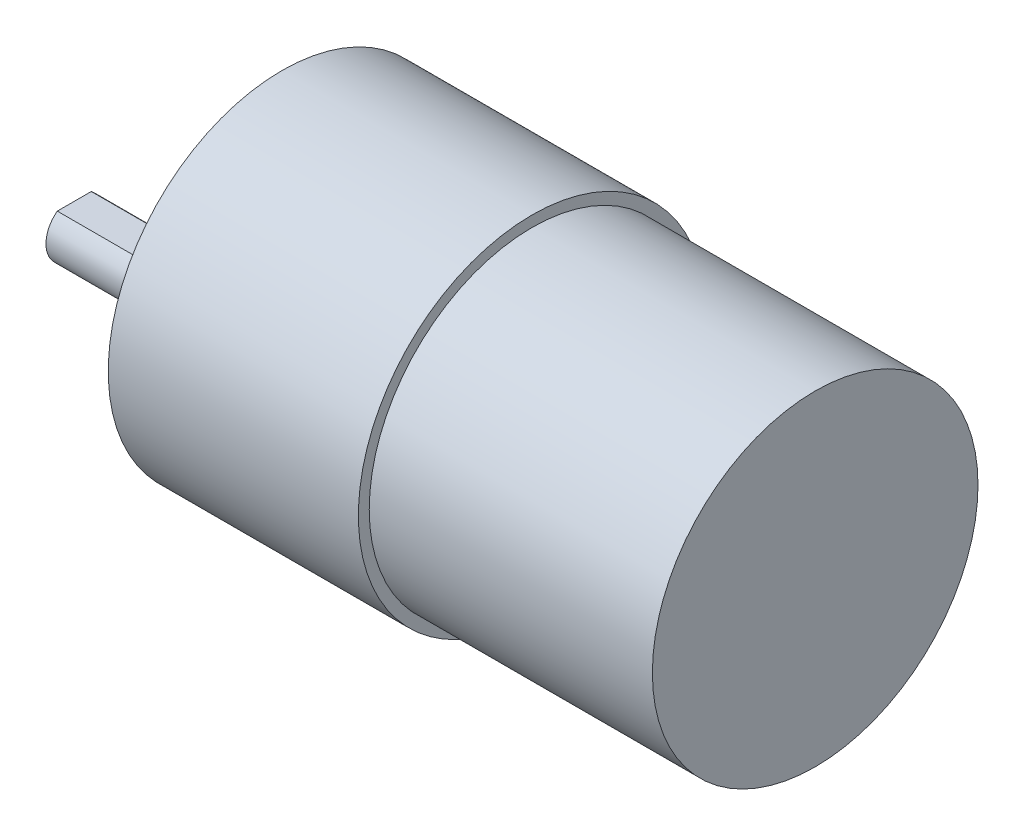
ISO-10303-21;
HEADER;
FILE_DESCRIPTION(('STEP AP214'),'2;1');
FILE_NAME('part.step','',(''),(''),'','','');
FILE_SCHEMA(('AUTOMOTIVE_DESIGN { 1 0 10303 214 1 1 1 1 }'));
ENDSEC;
DATA;
#1=APPLICATION_CONTEXT('core data for automotive mechanical design processes');
#2=APPLICATION_PROTOCOL_DEFINITION('international standard','automotive_design',2000,#1);
#3=PRODUCT_CONTEXT('',#1,'mechanical');
#4=PRODUCT('Part','Part','',(#3));
#5=PRODUCT_RELATED_PRODUCT_CATEGORY('part','',(#4));
#6=PRODUCT_DEFINITION_FORMATION('','',#4);
#7=PRODUCT_DEFINITION_CONTEXT('part definition',#1,'design');
#8=PRODUCT_DEFINITION('design','',#6,#7);
#9=PRODUCT_DEFINITION_SHAPE('','',#8);
#10=(LENGTH_UNIT() NAMED_UNIT(*) SI_UNIT(.MILLI.,.METRE.));
#11=(NAMED_UNIT(*) PLANE_ANGLE_UNIT() SI_UNIT($,.RADIAN.));
#12=(NAMED_UNIT(*) SI_UNIT($,.STERADIAN.) SOLID_ANGLE_UNIT());
#13=UNCERTAINTY_MEASURE_WITH_UNIT(LENGTH_MEASURE(1.E-05),#10,'distance_accuracy_value','');
#14=(GEOMETRIC_REPRESENTATION_CONTEXT(3) GLOBAL_UNCERTAINTY_ASSIGNED_CONTEXT((#13)) GLOBAL_UNIT_ASSIGNED_CONTEXT((#10,
#11,#12)) REPRESENTATION_CONTEXT('',''));
#15=CARTESIAN_POINT('',(0.,0.,0.));
#16=DIRECTION('',(0.,0.,1.));
#17=DIRECTION('',(1.,0.,0.));
#18=AXIS2_PLACEMENT_3D('',#15,#16,#17);
#19=CARTESIAN_POINT('',(-27.2521551588064,0.,0.));
#20=DIRECTION('',(-1.,0.,0.));
#21=DIRECTION('',(0.,-1.,0.));
#22=AXIS2_PLACEMENT_3D('',#19,#20,#21);
#23=PLANE('',#22);
#24=CARTESIAN_POINT('',(-27.2521551588064,-9.62592072726697,0.));
#25=DIRECTION('',(1.,0.,0.));
#26=DIRECTION('',(0.,1.,0.));
#27=AXIS2_PLACEMENT_3D('',#24,#25,#26);
#28=CIRCLE('',#27,17.25);
#29=CARTESIAN_POINT('',(-27.2521551588064,7.62407927273303,0.));
#30=VERTEX_POINT('',#29);
#31=EDGE_CURVE('E111',#30,#30,#28,.T.);
#32=ORIENTED_EDGE('',*,*,#31,.F.);
#33=EDGE_LOOP('',(#32));
#34=FACE_BOUND('',#33,.T.);
#35=CARTESIAN_POINT('',(-27.2521551588064,-9.62592072726697,0.));
#36=DIRECTION('',(1.,0.,0.));
#37=DIRECTION('',(0.,1.,0.));
#38=AXIS2_PLACEMENT_3D('',#35,#36,#37);
#39=CIRCLE('',#38,18.4);
#40=CARTESIAN_POINT('',(-27.2521551588064,8.77407927273302,0.));
#41=VERTEX_POINT('',#40);
#42=EDGE_CURVE('E102',#41,#41,#39,.T.);
#43=ORIENTED_EDGE('',*,*,#42,.T.);
#44=EDGE_LOOP('',(#43));
#45=FACE_BOUND('',#44,.T.);
#46=ADVANCED_FACE('F35',(#34,#45),#23,.F.);
#47=CARTESIAN_POINT('',(2.74784484119356,-9.62592072726697,0.));
#48=DIRECTION('',(1.,0.,0.));
#49=DIRECTION('',(0.,1.,0.));
#50=AXIS2_PLACEMENT_3D('',#47,#48,#49);
#51=CYLINDRICAL_SURFACE('',#50,17.25);
#52=ORIENTED_EDGE('',*,*,#31,.T.);
#53=EDGE_LOOP('',(#52));
#54=FACE_BOUND('',#53,.T.);
#55=CARTESIAN_POINT('',(2.74784484119356,-9.62592072726697,0.));
#56=DIRECTION('',(1.,0.,0.));
#57=DIRECTION('',(0.,1.,0.));
#58=AXIS2_PLACEMENT_3D('',#55,#56,#57);
#59=CIRCLE('',#58,17.25);
#60=CARTESIAN_POINT('',(2.74784484119356,7.62407927273303,0.));
#61=VERTEX_POINT('',#60);
#62=EDGE_CURVE('E108',#61,#61,#59,.T.);
#63=ORIENTED_EDGE('',*,*,#62,.F.);
#64=EDGE_LOOP('',(#63));
#65=FACE_BOUND('',#64,.T.);
#66=ADVANCED_FACE('F115',(#54,#65),#51,.T.);
#67=CARTESIAN_POINT('',(2.74784484119356,0.,0.));
#68=DIRECTION('',(-1.,0.,0.));
#69=DIRECTION('',(0.,-1.,0.));
#70=AXIS2_PLACEMENT_3D('',#67,#68,#69);
#71=PLANE('',#70);
#72=ORIENTED_EDGE('',*,*,#62,.T.);
#73=EDGE_LOOP('',(#72));
#74=FACE_BOUND('',#73,.T.);
#75=ADVANCED_FACE('F133',(#74),#71,.F.);
#76=CARTESIAN_POINT('',(-53.7521551588064,0.,0.));
#77=DIRECTION('',(1.,0.,0.));
#78=DIRECTION('',(0.,1.,0.));
#79=AXIS2_PLACEMENT_3D('',#76,#77,#78);
#80=PLANE('',#79);
#81=CARTESIAN_POINT('',(-53.7521551588064,-16.625920727267,0.));
#82=DIRECTION('',(1.,0.,0.));
#83=DIRECTION('',(0.,1.,0.));
#84=AXIS2_PLACEMENT_3D('',#81,#82,#83);
#85=CIRCLE('',#84,6.);
#86=CARTESIAN_POINT('',(-53.7521551588064,-10.625920727267,0.));
#87=VERTEX_POINT('',#86);
#88=EDGE_CURVE('E80',#87,#87,#85,.T.);
#89=ORIENTED_EDGE('',*,*,#88,.T.);
#90=EDGE_LOOP('',(#89));
#91=FACE_BOUND('',#90,.T.);
#92=CARTESIAN_POINT('',(-53.7521551588064,-9.62592072726698,0.));
#93=DIRECTION('',(1.,0.,0.));
#94=DIRECTION('',(0.,1.,0.));
#95=AXIS2_PLACEMENT_3D('',#92,#93,#94);
#96=CIRCLE('',#95,18.4);
#97=CARTESIAN_POINT('',(-53.7521551588064,8.77407927273302,0.));
#98=VERTEX_POINT('',#97);
#99=EDGE_CURVE('E105',#98,#98,#96,.T.);
#100=ORIENTED_EDGE('',*,*,#99,.F.);
#101=EDGE_LOOP('',(#100));
#102=FACE_BOUND('',#101,.T.);
#103=ADVANCED_FACE('F124',(#91,#102),#80,.F.);
#104=CARTESIAN_POINT('',(2.74784484119356,-9.62592072726697,0.));
#105=DIRECTION('',(1.,0.,0.));
#106=DIRECTION('',(0.,1.,0.));
#107=AXIS2_PLACEMENT_3D('',#104,#105,#106);
#108=CYLINDRICAL_SURFACE('',#107,18.4);
#109=ORIENTED_EDGE('',*,*,#99,.T.);
#110=EDGE_LOOP('',(#109));
#111=FACE_BOUND('',#110,.T.);
#112=ORIENTED_EDGE('',*,*,#42,.F.);
#113=EDGE_LOOP('',(#112));
#114=FACE_BOUND('',#113,.T.);
#115=ADVANCED_FACE('F122',(#111,#114),#108,.T.);
#116=CARTESIAN_POINT('',(2.74784484119356,-16.625920727267,0.));
#117=DIRECTION('',(1.,0.,0.));
#118=DIRECTION('',(0.,1.,0.));
#119=AXIS2_PLACEMENT_3D('',#116,#117,#118);
#120=CYLINDRICAL_SURFACE('',#119,3.);
#121=CARTESIAN_POINT('',(-63.7521551588064,-16.625920727267,0.));
#122=DIRECTION('',(1.,0.,0.));
#123=DIRECTION('',(0.,0.,-1.));
#124=AXIS2_PLACEMENT_3D('',#121,#122,#123);
#125=CIRCLE('',#124,3.);
#126=CARTESIAN_POINT('',(-63.7521551588064,-14.225920727267,1.8));
#127=VERTEX_POINT('',#126);
#128=CARTESIAN_POINT('',(-63.7521551588064,-14.225920727267,-1.8));
#129=VERTEX_POINT('',#128);
#130=EDGE_CURVE('E11',#127,#129,#125,.F.);
#131=ORIENTED_EDGE('',*,*,#130,.F.);
#132=DIRECTION('',(1.,0.,0.));
#133=VECTOR('',#132,1.);
#134=CARTESIAN_POINT('',(2.74784484119356,-14.225920727267,1.8));
#135=LINE('',#134,#133);
#136=CARTESIAN_POINT('',(-75.7521551588064,-14.225920727267,1.8));
#137=VERTEX_POINT('',#136);
#138=EDGE_CURVE('E64',#137,#127,#135,.T.);
#139=ORIENTED_EDGE('',*,*,#138,.F.);
#140=CARTESIAN_POINT('',(-75.7521551588064,-16.625920727267,0.));
#141=DIRECTION('',(1.,0.,0.));
#142=DIRECTION('',(0.,1.,0.));
#143=AXIS2_PLACEMENT_3D('',#140,#141,#142);
#144=CIRCLE('',#143,3.);
#145=CARTESIAN_POINT('',(-75.7521551588064,-14.225920727267,-1.8));
#146=VERTEX_POINT('',#145);
#147=EDGE_CURVE('E70',#137,#146,#144,.T.);
#148=ORIENTED_EDGE('',*,*,#147,.T.);
#149=DIRECTION('',(1.,0.,0.));
#150=VECTOR('',#149,1.);
#151=CARTESIAN_POINT('',(2.74784484119356,-14.225920727267,-1.8));
#152=LINE('',#151,#150);
#153=EDGE_CURVE('E49',#129,#146,#152,.F.);
#154=ORIENTED_EDGE('',*,*,#153,.F.);
#155=EDGE_LOOP('',(#131,#139,#148,#154));
#156=FACE_BOUND('',#155,.T.);
#157=CARTESIAN_POINT('',(-60.2521551588064,-16.625920727267,0.));
#158=DIRECTION('',(1.,0.,0.));
#159=DIRECTION('',(0.,1.,0.));
#160=AXIS2_PLACEMENT_3D('',#157,#158,#159);
#161=CIRCLE('',#160,3.);
#162=CARTESIAN_POINT('',(-60.2521551588064,-13.625920727267,0.));
#163=VERTEX_POINT('',#162);
#164=EDGE_CURVE('E71',#163,#163,#161,.T.);
#165=ORIENTED_EDGE('',*,*,#164,.F.);
#166=EDGE_LOOP('',(#165));
#167=FACE_BOUND('',#166,.T.);
#168=ADVANCED_FACE('F67',(#156,#167),#120,.T.);
#169=CARTESIAN_POINT('',(-75.7521551588064,0.,0.));
#170=DIRECTION('',(-1.,0.,0.));
#171=DIRECTION('',(0.,-1.,0.));
#172=AXIS2_PLACEMENT_3D('',#169,#170,#171);
#173=PLANE('',#172);
#174=ORIENTED_EDGE('',*,*,#147,.F.);
#175=DIRECTION('',(0.,0.,1.));
#176=VECTOR('',#175,1.);
#177=CARTESIAN_POINT('',(-75.7521551588064,-14.225920727267,0.));
#178=LINE('',#177,#176);
#179=EDGE_CURVE('E42',#146,#137,#178,.T.);
#180=ORIENTED_EDGE('',*,*,#179,.F.);
#181=EDGE_LOOP('',(#174,#180));
#182=FACE_BOUND('',#181,.T.);
#183=ADVANCED_FACE('F131',(#182),#173,.T.);
#184=CARTESIAN_POINT('',(2.74784484119356,-16.625920727267,0.));
#185=DIRECTION('',(1.,0.,0.));
#186=DIRECTION('',(0.,1.,0.));
#187=AXIS2_PLACEMENT_3D('',#184,#185,#186);
#188=CYLINDRICAL_SURFACE('',#187,6.);
#189=CARTESIAN_POINT('',(-60.2521551588064,-16.625920727267,0.));
#190=DIRECTION('',(1.,0.,0.));
#191=DIRECTION('',(0.,1.,0.));
#192=AXIS2_PLACEMENT_3D('',#189,#190,#191);
#193=CIRCLE('',#192,6.);
#194=CARTESIAN_POINT('',(-60.2521551588064,-10.625920727267,0.));
#195=VERTEX_POINT('',#194);
#196=EDGE_CURVE('E74',#195,#195,#193,.T.);
#197=ORIENTED_EDGE('',*,*,#196,.T.);
#198=EDGE_LOOP('',(#197));
#199=FACE_BOUND('',#198,.T.);
#200=ORIENTED_EDGE('',*,*,#88,.F.);
#201=EDGE_LOOP('',(#200));
#202=FACE_BOUND('',#201,.T.);
#203=ADVANCED_FACE('F167',(#199,#202),#188,.T.);
#204=CARTESIAN_POINT('',(-60.2521551588064,0.,0.));
#205=DIRECTION('',(-1.,0.,0.));
#206=DIRECTION('',(0.,-1.,0.));
#207=AXIS2_PLACEMENT_3D('',#204,#205,#206);
#208=PLANE('',#207);
#209=ORIENTED_EDGE('',*,*,#164,.T.);
#210=EDGE_LOOP('',(#209));
#211=FACE_BOUND('',#210,.T.);
#212=ORIENTED_EDGE('',*,*,#196,.F.);
#213=EDGE_LOOP('',(#212));
#214=FACE_BOUND('',#213,.T.);
#215=ADVANCED_FACE('F172',(#211,#214),#208,.T.);
#216=CARTESIAN_POINT('',(0.,-14.225920727267,-18.4));
#217=DIRECTION('',(0.,-1.,0.));
#218=DIRECTION('',(1.,0.,0.));
#219=AXIS2_PLACEMENT_3D('',#216,#217,#218);
#220=PLANE('',#219);
#221=ORIENTED_EDGE('',*,*,#138,.T.);
#222=DIRECTION('',(0.,0.,1.));
#223=VECTOR('',#222,1.);
#224=CARTESIAN_POINT('',(-63.7521551588064,-14.225920727267,-18.4));
#225=LINE('',#224,#223);
#226=EDGE_CURVE('E61',#129,#127,#225,.T.);
#227=ORIENTED_EDGE('',*,*,#226,.F.);
#228=ORIENTED_EDGE('',*,*,#153,.T.);
#229=ORIENTED_EDGE('',*,*,#179,.T.);
#230=EDGE_LOOP('',(#221,#227,#228,#229));
#231=FACE_BOUND('',#230,.T.);
#232=ADVANCED_FACE('F63',(#231),#220,.F.);
#233=CARTESIAN_POINT('',(-63.7521551588064,0.,-18.4));
#234=DIRECTION('',(1.,0.,0.));
#235=DIRECTION('',(0.,0.,-1.));
#236=AXIS2_PLACEMENT_3D('',#233,#234,#235);
#237=PLANE('',#236);
#238=ORIENTED_EDGE('',*,*,#226,.T.);
#239=ORIENTED_EDGE('',*,*,#130,.T.);
#240=EDGE_LOOP('',(#238,#239));
#241=FACE_BOUND('',#240,.T.);
#242=ADVANCED_FACE('F60',(#241),#237,.F.);
#243=CLOSED_SHELL('',(#46,#66,#75,#103,#115,#168,#183,#203,#215,#232,#242));
#244=CARTESIAN_POINT('',(-29.7921551588064,0.,0.));
#245=DIRECTION('',(-1.,0.,0.));
#246=DIRECTION('',(0.,-1.,0.));
#247=AXIS2_PLACEMENT_3D('',#244,#245,#246);
#248=PLANE('',#247);
#249=CARTESIAN_POINT('',(-29.7921551588064,-9.62592072726697,0.));
#250=DIRECTION('',(1.,0.,0.));
#251=DIRECTION('',(0.,1.,0.));
#252=AXIS2_PLACEMENT_3D('',#249,#250,#251);
#253=CIRCLE('',#252,14.71);
#254=CARTESIAN_POINT('',(-29.7921551588064,5.08407927273303,0.));
#255=VERTEX_POINT('',#254);
#256=EDGE_CURVE('E99',#255,#255,#253,.T.);
#257=ORIENTED_EDGE('',*,*,#256,.T.);
#258=EDGE_LOOP('',(#257));
#259=FACE_BOUND('',#258,.T.);
#260=CARTESIAN_POINT('',(-29.7921551588064,-9.62592072726697,0.));
#261=DIRECTION('',(1.,0.,0.));
#262=DIRECTION('',(0.,1.,0.));
#263=AXIS2_PLACEMENT_3D('',#260,#261,#262);
#264=CIRCLE('',#263,15.86);
#265=CARTESIAN_POINT('',(-29.7921551588064,6.23407927273302,0.));
#266=VERTEX_POINT('',#265);
#267=EDGE_CURVE('E84',#266,#266,#264,.T.);
#268=ORIENTED_EDGE('',*,*,#267,.F.);
#269=EDGE_LOOP('',(#268));
#270=FACE_BOUND('',#269,.T.);
#271=ADVANCED_FACE('F137',(#259,#270),#248,.T.);
#272=CARTESIAN_POINT('',(2.74784484119356,-9.62592072726697,0.));
#273=DIRECTION('',(1.,0.,0.));
#274=DIRECTION('',(0.,1.,0.));
#275=AXIS2_PLACEMENT_3D('',#272,#273,#274);
#276=CYLINDRICAL_SURFACE('',#275,14.71);
#277=ORIENTED_EDGE('',*,*,#256,.F.);
#278=EDGE_LOOP('',(#277));
#279=FACE_BOUND('',#278,.T.);
#280=CARTESIAN_POINT('',(0.207844841193561,-9.62592072726697,0.));
#281=DIRECTION('',(1.,0.,0.));
#282=DIRECTION('',(0.,1.,0.));
#283=AXIS2_PLACEMENT_3D('',#280,#281,#282);
#284=CIRCLE('',#283,14.71);
#285=CARTESIAN_POINT('',(0.207844841193559,5.08407927273303,0.));
#286=VERTEX_POINT('',#285);
#287=EDGE_CURVE('E96',#286,#286,#284,.T.);
#288=ORIENTED_EDGE('',*,*,#287,.T.);
#289=EDGE_LOOP('',(#288));
#290=FACE_BOUND('',#289,.T.);
#291=ADVANCED_FACE('F222',(#279,#290),#276,.F.);
#292=CARTESIAN_POINT('',(0.20784484119356,0.,0.));
#293=DIRECTION('',(-1.,0.,0.));
#294=DIRECTION('',(0.,-1.,0.));
#295=AXIS2_PLACEMENT_3D('',#292,#293,#294);
#296=PLANE('',#295);
#297=CARTESIAN_POINT('',(0.207844841193561,-9.62592072726697,0.));
#298=DIRECTION('',(1.,0.,0.));
#299=DIRECTION('',(0.,1.,0.));
#300=AXIS2_PLACEMENT_3D('',#297,#298,#299);
#301=CIRCLE('',#300,2.54);
#302=CARTESIAN_POINT('',(0.207844841193561,-7.08592072726697,0.));
#303=VERTEX_POINT('',#302);
#304=EDGE_CURVE('E93',#303,#303,#301,.T.);
#305=ORIENTED_EDGE('',*,*,#304,.T.);
#306=EDGE_LOOP('',(#305));
#307=FACE_BOUND('',#306,.T.);
#308=ORIENTED_EDGE('',*,*,#287,.F.);
#309=EDGE_LOOP('',(#308));
#310=FACE_BOUND('',#309,.T.);
#311=ADVANCED_FACE('F230',(#307,#310),#296,.T.);
#312=CARTESIAN_POINT('',(2.74784484119356,-9.62592072726697,0.));
#313=DIRECTION('',(1.,0.,0.));
#314=DIRECTION('',(0.,1.,0.));
#315=AXIS2_PLACEMENT_3D('',#312,#313,#314);
#316=CYLINDRICAL_SURFACE('',#315,2.54);
#317=CARTESIAN_POINT('',(-51.2121551588064,-9.62592072726698,0.));
#318=DIRECTION('',(1.,0.,0.));
#319=DIRECTION('',(0.,1.,0.));
#320=AXIS2_PLACEMENT_3D('',#317,#318,#319);
#321=CIRCLE('',#320,2.53999999999999);
#322=CARTESIAN_POINT('',(-51.2121551588064,-7.08592072726698,0.));
#323=VERTEX_POINT('',#322);
#324=EDGE_CURVE('E90',#323,#323,#321,.T.);
#325=ORIENTED_EDGE('',*,*,#324,.T.);
#326=EDGE_LOOP('',(#325));
#327=FACE_BOUND('',#326,.T.);
#328=ORIENTED_EDGE('',*,*,#304,.F.);
#329=EDGE_LOOP('',(#328));
#330=FACE_BOUND('',#329,.T.);
#331=ADVANCED_FACE('F237',(#327,#330),#316,.T.);
#332=CARTESIAN_POINT('',(-51.2121551588064,0.,0.));
#333=DIRECTION('',(1.,0.,0.));
#334=DIRECTION('',(0.,1.,0.));
#335=AXIS2_PLACEMENT_3D('',#332,#333,#334);
#336=PLANE('',#335);
#337=CARTESIAN_POINT('',(-51.2121551588064,-9.62592072726698,0.));
#338=DIRECTION('',(1.,0.,0.));
#339=DIRECTION('',(0.,1.,0.));
#340=AXIS2_PLACEMENT_3D('',#337,#338,#339);
#341=CIRCLE('',#340,15.86);
#342=CARTESIAN_POINT('',(-51.2121551588064,6.23407927273302,0.));
#343=VERTEX_POINT('',#342);
#344=EDGE_CURVE('E87',#343,#343,#341,.T.);
#345=ORIENTED_EDGE('',*,*,#344,.T.);
#346=EDGE_LOOP('',(#345));
#347=FACE_BOUND('',#346,.T.);
#348=ORIENTED_EDGE('',*,*,#324,.F.);
#349=EDGE_LOOP('',(#348));
#350=FACE_BOUND('',#349,.T.);
#351=ADVANCED_FACE('F245',(#347,#350),#336,.T.);
#352=CARTESIAN_POINT('',(2.74784484119356,-9.62592072726697,0.));
#353=DIRECTION('',(1.,0.,0.));
#354=DIRECTION('',(0.,1.,0.));
#355=AXIS2_PLACEMENT_3D('',#352,#353,#354);
#356=CYLINDRICAL_SURFACE('',#355,15.86);
#357=ORIENTED_EDGE('',*,*,#344,.F.);
#358=EDGE_LOOP('',(#357));
#359=FACE_BOUND('',#358,.T.);
#360=ORIENTED_EDGE('',*,*,#267,.T.);
#361=EDGE_LOOP('',(#360));
#362=FACE_BOUND('',#361,.T.);
#363=ADVANCED_FACE('F162',(#359,#362),#356,.F.);
#364=CLOSED_SHELL('',(#271,#291,#311,#331,#351,#363));
#365=ORIENTED_CLOSED_SHELL('',*,#364,.T.);
#366=BREP_WITH_VOIDS('B2',#243,(#365));
#367=ADVANCED_BREP_SHAPE_REPRESENTATION('',(#18,#366),#14);
#368=SHAPE_DEFINITION_REPRESENTATION(#9,#367);
ENDSEC;
END-ISO-10303-21;
